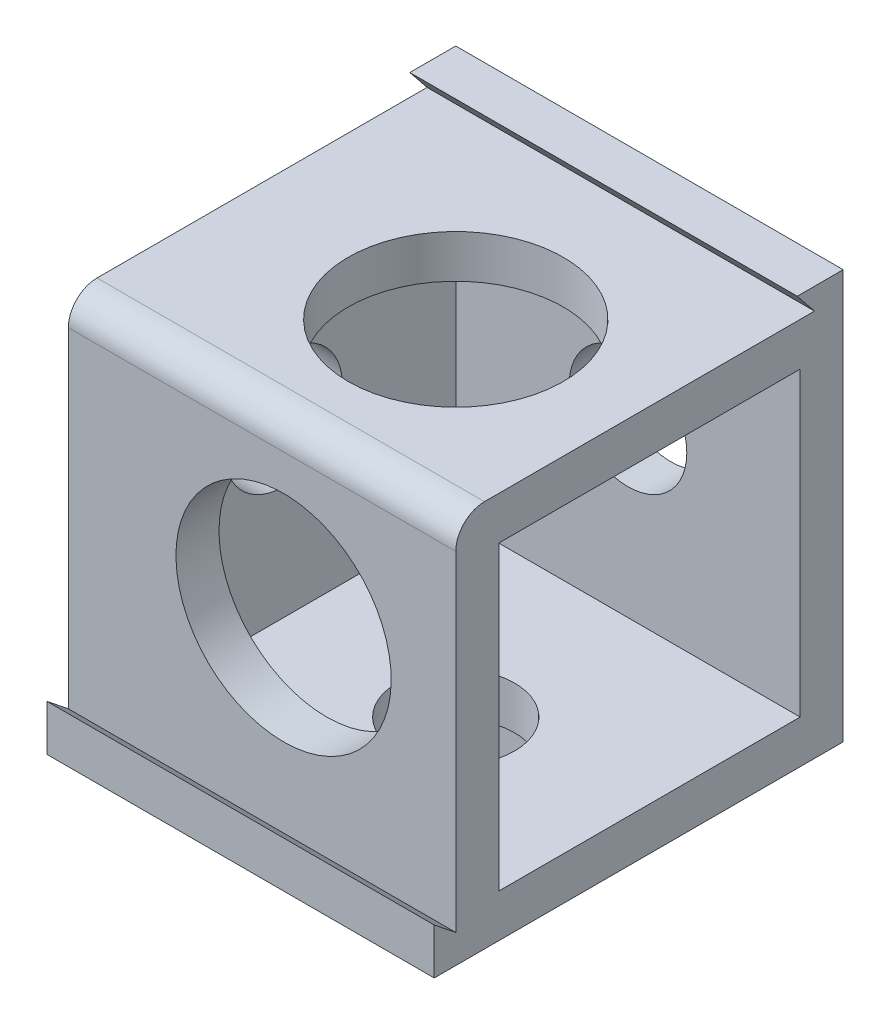
ISO-10303-21;
HEADER;
FILE_DESCRIPTION(('STEP AP214'),'2;1');
FILE_NAME('part.step','',(''),(''),'','','');
FILE_SCHEMA(('AUTOMOTIVE_DESIGN { 1 0 10303 214 1 1 1 1 }'));
ENDSEC;
DATA;
#1=APPLICATION_CONTEXT('core data for automotive mechanical design processes');
#2=APPLICATION_PROTOCOL_DEFINITION('international standard','automotive_design',2000,#1);
#3=PRODUCT_CONTEXT('',#1,'mechanical');
#4=PRODUCT('Part','Part','',(#3));
#5=PRODUCT_RELATED_PRODUCT_CATEGORY('part','',(#4));
#6=PRODUCT_DEFINITION_FORMATION('','',#4);
#7=PRODUCT_DEFINITION_CONTEXT('part definition',#1,'design');
#8=PRODUCT_DEFINITION('design','',#6,#7);
#9=PRODUCT_DEFINITION_SHAPE('','',#8);
#10=(LENGTH_UNIT() NAMED_UNIT(*) SI_UNIT(.MILLI.,.METRE.));
#11=(NAMED_UNIT(*) PLANE_ANGLE_UNIT() SI_UNIT($,.RADIAN.));
#12=(NAMED_UNIT(*) SI_UNIT($,.STERADIAN.) SOLID_ANGLE_UNIT());
#13=UNCERTAINTY_MEASURE_WITH_UNIT(LENGTH_MEASURE(1.E-05),#10,'distance_accuracy_value','');
#14=(GEOMETRIC_REPRESENTATION_CONTEXT(3) GLOBAL_UNCERTAINTY_ASSIGNED_CONTEXT((#13)) GLOBAL_UNIT_ASSIGNED_CONTEXT((#10,
#11,#12)) REPRESENTATION_CONTEXT('',''));
#15=CARTESIAN_POINT('',(0.,0.,0.));
#16=DIRECTION('',(0.,0.,1.));
#17=DIRECTION('',(1.,0.,0.));
#18=AXIS2_PLACEMENT_3D('',#15,#16,#17);
#19=CARTESIAN_POINT('',(0.,13.5,-15.));
#20=DIRECTION('',(-1.,0.,0.));
#21=DIRECTION('',(0.,-1.,0.));
#22=AXIS2_PLACEMENT_3D('',#19,#20,#21);
#23=PLANE('',#22);
#24=DIRECTION('',(0.,0.,-1.));
#25=VECTOR('',#24,1.);
#26=CARTESIAN_POINT('',(0.,-6.1,-3.85));
#27=LINE('',#26,#25);
#28=CARTESIAN_POINT('',(0.,-6.1,3.85));
#29=VERTEX_POINT('',#28);
#30=CARTESIAN_POINT('',(0.,-6.1,-3.85));
#31=VERTEX_POINT('',#30);
#32=EDGE_CURVE('E257',#29,#31,#27,.T.);
#33=ORIENTED_EDGE('',*,*,#32,.F.);
#34=DIRECTION('',(0.,1.,0.));
#35=VECTOR('',#34,1.);
#36=CARTESIAN_POINT('',(0.,-6.1,3.85));
#37=LINE('',#36,#35);
#38=CARTESIAN_POINT('',(0.,-14.5,3.85));
#39=VERTEX_POINT('',#38);
#40=EDGE_CURVE('E243',#39,#29,#37,.T.);
#41=ORIENTED_EDGE('',*,*,#40,.F.);
#42=DIRECTION('',(0.,0.,1.));
#43=VECTOR('',#42,1.);
#44=CARTESIAN_POINT('',(0.,-14.5,-3.85));
#45=LINE('',#44,#43);
#46=CARTESIAN_POINT('',(0.,-14.5,-3.85));
#47=VERTEX_POINT('',#46);
#48=EDGE_CURVE('E248',#47,#39,#45,.T.);
#49=ORIENTED_EDGE('',*,*,#48,.F.);
#50=DIRECTION('',(0.,-1.,0.));
#51=VECTOR('',#50,1.);
#52=CARTESIAN_POINT('',(0.,-6.1,-3.85));
#53=LINE('',#52,#51);
#54=EDGE_CURVE('E259',#31,#47,#53,.T.);
#55=ORIENTED_EDGE('',*,*,#54,.F.);
#56=EDGE_LOOP('',(#33,#41,#49,#55));
#57=FACE_BOUND('',#56,.T.);
#58=DIRECTION('',(0.,1.,0.));
#59=VECTOR('',#58,1.);
#60=CARTESIAN_POINT('',(0.,12.,12.));
#61=LINE('',#60,#59);
#62=CARTESIAN_POINT('',(0.,-13.,12.));
#63=VERTEX_POINT('',#62);
#64=CARTESIAN_POINT('',(0.,10.,12.));
#65=VERTEX_POINT('',#64);
#66=EDGE_CURVE('E304',#63,#65,#61,.T.);
#67=ORIENTED_EDGE('',*,*,#66,.T.);
#68=CARTESIAN_POINT('',(0.,10.,10.));
#69=DIRECTION('',(-1.,0.,0.));
#70=DIRECTION('',(0.,-1.,0.));
#71=AXIS2_PLACEMENT_3D('',#68,#69,#70);
#72=CIRCLE('',#71,2.);
#73=CARTESIAN_POINT('',(0.,12.,10.));
#74=VERTEX_POINT('',#73);
#75=EDGE_CURVE('E368',#65,#74,#72,.T.);
#76=ORIENTED_EDGE('',*,*,#75,.T.);
#77=DIRECTION('',(0.,0.,-1.));
#78=VECTOR('',#77,1.);
#79=CARTESIAN_POINT('',(0.,12.,-13.));
#80=LINE('',#79,#78);
#81=CARTESIAN_POINT('',(0.,12.,-13.));
#82=VERTEX_POINT('',#81);
#83=EDGE_CURVE('E318',#74,#82,#80,.T.);
#84=ORIENTED_EDGE('',*,*,#83,.T.);
#85=DIRECTION('',(0.,0.78086880944303,0.624695047554425));
#86=VECTOR('',#85,1.);
#87=CARTESIAN_POINT('',(0.,13.5,-11.8));
#88=LINE('',#87,#86);
#89=CARTESIAN_POINT('',(0.,13.5,-11.8));
#90=VERTEX_POINT('',#89);
#91=EDGE_CURVE('E320',#82,#90,#88,.T.);
#92=ORIENTED_EDGE('',*,*,#91,.T.);
#93=DIRECTION('',(0.,0.,1.));
#94=VECTOR('',#93,1.);
#95=CARTESIAN_POINT('',(0.,13.5,-15.));
#96=LINE('',#95,#94);
#97=CARTESIAN_POINT('',(0.,13.5,-15.));
#98=VERTEX_POINT('',#97);
#99=EDGE_CURVE('E361',#98,#90,#96,.T.);
#100=ORIENTED_EDGE('',*,*,#99,.F.);
#101=DIRECTION('',(0.,-1.,0.));
#102=VECTOR('',#101,1.);
#103=CARTESIAN_POINT('',(0.,13.5,-15.));
#104=LINE('',#103,#102);
#105=CARTESIAN_POINT('',(0.,-15.,-15.));
#106=VERTEX_POINT('',#105);
#107=EDGE_CURVE('E348',#98,#106,#104,.T.);
#108=ORIENTED_EDGE('',*,*,#107,.T.);
#109=DIRECTION('',(0.,0.,1.));
#110=VECTOR('',#109,1.);
#111=CARTESIAN_POINT('',(0.,-15.,-15.));
#112=LINE('',#111,#110);
#113=CARTESIAN_POINT('',(0.,-15.,13.5));
#114=VERTEX_POINT('',#113);
#115=EDGE_CURVE('E358',#106,#114,#112,.T.);
#116=ORIENTED_EDGE('',*,*,#115,.T.);
#117=DIRECTION('',(0.,-1.,0.));
#118=VECTOR('',#117,1.);
#119=CARTESIAN_POINT('',(0.,13.5,13.5));
#120=LINE('',#119,#118);
#121=CARTESIAN_POINT('',(0.,-11.8,13.5));
#122=VERTEX_POINT('',#121);
#123=EDGE_CURVE('E337',#122,#114,#120,.T.);
#124=ORIENTED_EDGE('',*,*,#123,.F.);
#125=DIRECTION('',(0.,-0.624695047554425,-0.78086880944303));
#126=VECTOR('',#125,1.);
#127=CARTESIAN_POINT('',(0.,-11.8,13.5));
#128=LINE('',#127,#126);
#129=EDGE_CURVE('E309',#122,#63,#128,.T.);
#130=ORIENTED_EDGE('',*,*,#129,.T.);
#131=EDGE_LOOP('',(#67,#76,#84,#92,#100,#108,#116,#124,#130));
#132=FACE_BOUND('',#131,.T.);
#133=CARTESIAN_POINT('',(0.,0.,0.));
#134=DIRECTION('',(1.,0.,0.));
#135=DIRECTION('',(0.,0.,-1.));
#136=AXIS2_PLACEMENT_3D('',#133,#134,#135);
#137=CIRCLE('',#136,4.1);
#138=CARTESIAN_POINT('',(0.,0.,-4.1));
#139=VERTEX_POINT('',#138);
#140=EDGE_CURVE('E381',#139,#139,#137,.T.);
#141=ORIENTED_EDGE('',*,*,#140,.T.);
#142=EDGE_LOOP('',(#141));
#143=FACE_BOUND('',#142,.T.);
#144=ADVANCED_FACE('F16',(#57,#132,#143),#23,.T.);
#145=CARTESIAN_POINT('',(3.,13.5,-15.));
#146=DIRECTION('',(-1.,0.,0.));
#147=DIRECTION('',(0.,-1.,0.));
#148=AXIS2_PLACEMENT_3D('',#145,#146,#147);
#149=PLANE('',#148);
#150=DIRECTION('',(0.,0.,1.));
#151=VECTOR('',#150,1.);
#152=CARTESIAN_POINT('',(3.,-12.,-15.));
#153=LINE('',#152,#151);
#154=CARTESIAN_POINT('',(3.,-12.,-12.));
#155=VERTEX_POINT('',#154);
#156=CARTESIAN_POINT('',(3.,-12.,9.));
#157=VERTEX_POINT('',#156);
#158=EDGE_CURVE('E282',#155,#157,#153,.T.);
#159=ORIENTED_EDGE('',*,*,#158,.F.);
#160=DIRECTION('',(0.,-1.,0.));
#161=VECTOR('',#160,1.);
#162=CARTESIAN_POINT('',(3.,0.,-12.));
#163=LINE('',#162,#161);
#164=CARTESIAN_POINT('',(3.,9.,-12.));
#165=VERTEX_POINT('',#164);
#166=EDGE_CURVE('E278',#165,#155,#163,.T.);
#167=ORIENTED_EDGE('',*,*,#166,.F.);
#168=DIRECTION('',(0.,0.,-1.));
#169=VECTOR('',#168,1.);
#170=CARTESIAN_POINT('',(3.,9.,-15.));
#171=LINE('',#170,#169);
#172=CARTESIAN_POINT('',(3.,9.,9.));
#173=VERTEX_POINT('',#172);
#174=EDGE_CURVE('E274',#173,#165,#171,.T.);
#175=ORIENTED_EDGE('',*,*,#174,.F.);
#176=DIRECTION('',(0.,1.,0.));
#177=VECTOR('',#176,1.);
#178=CARTESIAN_POINT('',(3.,13.5,9.));
#179=LINE('',#178,#177);
#180=EDGE_CURVE('E272',#157,#173,#179,.T.);
#181=ORIENTED_EDGE('',*,*,#180,.F.);
#182=EDGE_LOOP('',(#159,#167,#175,#181));
#183=FACE_BOUND('',#182,.T.);
#184=CARTESIAN_POINT('',(3.,0.,0.));
#185=DIRECTION('',(-1.,0.,0.));
#186=DIRECTION('',(0.,-1.,0.));
#187=AXIS2_PLACEMENT_3D('',#184,#185,#186);
#188=CIRCLE('',#187,4.1);
#189=CARTESIAN_POINT('',(3.,-4.1,0.));
#190=VERTEX_POINT('',#189);
#191=EDGE_CURVE('E379',#190,#190,#188,.F.);
#192=ORIENTED_EDGE('',*,*,#191,.F.);
#193=EDGE_LOOP('',(#192));
#194=FACE_BOUND('',#193,.T.);
#195=ADVANCED_FACE('F430',(#183,#194),#149,.F.);
#196=CARTESIAN_POINT('',(27.,12.,12.));
#197=DIRECTION('',(0.,0.,1.));
#198=DIRECTION('',(0.,-1.,0.));
#199=AXIS2_PLACEMENT_3D('',#196,#197,#198);
#200=PLANE('',#199);
#201=DIRECTION('',(0.,1.,0.));
#202=VECTOR('',#201,1.);
#203=CARTESIAN_POINT('',(27.,12.,12.));
#204=LINE('',#203,#202);
#205=CARTESIAN_POINT('',(27.,-13.,12.));
#206=VERTEX_POINT('',#205);
#207=CARTESIAN_POINT('',(27.,10.,12.));
#208=VERTEX_POINT('',#207);
#209=EDGE_CURVE('E305',#206,#208,#204,.T.);
#210=ORIENTED_EDGE('',*,*,#209,.T.);
#211=DIRECTION('',(-1.,0.,0.));
#212=VECTOR('',#211,1.);
#213=CARTESIAN_POINT('',(27.,10.,12.));
#214=LINE('',#213,#212);
#215=EDGE_CURVE('E357',#208,#65,#214,.T.);
#216=ORIENTED_EDGE('',*,*,#215,.T.);
#217=ORIENTED_EDGE('',*,*,#66,.F.);
#218=DIRECTION('',(-1.,0.,0.));
#219=VECTOR('',#218,1.);
#220=CARTESIAN_POINT('',(27.,-13.,12.));
#221=LINE('',#220,#219);
#222=EDGE_CURVE('E315',#206,#63,#221,.T.);
#223=ORIENTED_EDGE('',*,*,#222,.F.);
#224=EDGE_LOOP('',(#210,#216,#217,#223));
#225=FACE_BOUND('',#224,.T.);
#226=CARTESIAN_POINT('',(15.,0.,12.));
#227=DIRECTION('',(0.,0.,1.));
#228=DIRECTION('',(0.,-1.,0.));
#229=AXIS2_PLACEMENT_3D('',#226,#227,#228);
#230=CIRCLE('',#229,7.5);
#231=CARTESIAN_POINT('',(15.,-7.5,12.));
#232=VERTEX_POINT('',#231);
#233=EDGE_CURVE('E375',#232,#232,#230,.F.);
#234=ORIENTED_EDGE('',*,*,#233,.T.);
#235=EDGE_LOOP('',(#234));
#236=FACE_BOUND('',#235,.T.);
#237=ADVANCED_FACE('F437',(#225,#236),#200,.T.);
#238=CARTESIAN_POINT('',(27.,12.,9.));
#239=DIRECTION('',(0.,0.,1.));
#240=DIRECTION('',(0.,-1.,0.));
#241=AXIS2_PLACEMENT_3D('',#238,#239,#240);
#242=PLANE('',#241);
#243=DIRECTION('',(-1.,0.,0.));
#244=VECTOR('',#243,1.);
#245=CARTESIAN_POINT('',(0.,-12.,9.));
#246=LINE('',#245,#244);
#247=CARTESIAN_POINT('',(27.,-12.,9.));
#248=VERTEX_POINT('',#247);
#249=EDGE_CURVE('E302',#248,#157,#246,.T.);
#250=ORIENTED_EDGE('',*,*,#249,.T.);
#251=ORIENTED_EDGE('',*,*,#180,.T.);
#252=DIRECTION('',(1.,0.,0.));
#253=VECTOR('',#252,1.);
#254=CARTESIAN_POINT('',(27.,9.,9.));
#255=LINE('',#254,#253);
#256=CARTESIAN_POINT('',(27.,9.,9.));
#257=VERTEX_POINT('',#256);
#258=EDGE_CURVE('E288',#173,#257,#255,.T.);
#259=ORIENTED_EDGE('',*,*,#258,.T.);
#260=DIRECTION('',(0.,1.,0.));
#261=VECTOR('',#260,1.);
#262=CARTESIAN_POINT('',(27.,12.,9.));
#263=LINE('',#262,#261);
#264=EDGE_CURVE('E277',#248,#257,#263,.T.);
#265=ORIENTED_EDGE('',*,*,#264,.F.);
#266=EDGE_LOOP('',(#250,#251,#259,#265));
#267=FACE_BOUND('',#266,.T.);
#268=CARTESIAN_POINT('',(15.,0.,9.));
#269=DIRECTION('',(0.,0.,1.));
#270=DIRECTION('',(0.,-1.,0.));
#271=AXIS2_PLACEMENT_3D('',#268,#269,#270);
#272=CIRCLE('',#271,7.5);
#273=CARTESIAN_POINT('',(15.,-7.5,9.));
#274=VERTEX_POINT('',#273);
#275=EDGE_CURVE('E376',#274,#274,#272,.F.);
#276=ORIENTED_EDGE('',*,*,#275,.F.);
#277=EDGE_LOOP('',(#276));
#278=FACE_BOUND('',#277,.T.);
#279=ADVANCED_FACE('F496',(#267,#278),#242,.F.);
#280=CARTESIAN_POINT('',(27.,12.,-13.));
#281=DIRECTION('',(0.,1.,0.));
#282=DIRECTION('',(0.,0.,1.));
#283=AXIS2_PLACEMENT_3D('',#280,#281,#282);
#284=PLANE('',#283);
#285=ORIENTED_EDGE('',*,*,#83,.F.);
#286=DIRECTION('',(-1.,0.,0.));
#287=VECTOR('',#286,1.);
#288=CARTESIAN_POINT('',(27.,12.,10.));
#289=LINE('',#288,#287);
#290=CARTESIAN_POINT('',(27.,12.,10.));
#291=VERTEX_POINT('',#290);
#292=EDGE_CURVE('E25',#74,#291,#289,.F.);
#293=ORIENTED_EDGE('',*,*,#292,.T.);
#294=DIRECTION('',(0.,0.,-1.));
#295=VECTOR('',#294,1.);
#296=CARTESIAN_POINT('',(27.,12.,-13.));
#297=LINE('',#296,#295);
#298=CARTESIAN_POINT('',(27.,12.,-13.));
#299=VERTEX_POINT('',#298);
#300=EDGE_CURVE('E308',#291,#299,#297,.T.);
#301=ORIENTED_EDGE('',*,*,#300,.T.);
#302=DIRECTION('',(-1.,0.,0.));
#303=VECTOR('',#302,1.);
#304=CARTESIAN_POINT('',(27.,12.,-13.));
#305=LINE('',#304,#303);
#306=EDGE_CURVE('E331',#299,#82,#305,.T.);
#307=ORIENTED_EDGE('',*,*,#306,.T.);
#308=EDGE_LOOP('',(#285,#293,#301,#307));
#309=FACE_BOUND('',#308,.T.);
#310=CARTESIAN_POINT('',(15.,12.,0.));
#311=DIRECTION('',(0.,1.,0.));
#312=DIRECTION('',(0.,0.,1.));
#313=AXIS2_PLACEMENT_3D('',#310,#311,#312);
#314=CIRCLE('',#313,7.5);
#315=CARTESIAN_POINT('',(15.,12.,7.5));
#316=VERTEX_POINT('',#315);
#317=EDGE_CURVE('E374',#316,#316,#314,.F.);
#318=ORIENTED_EDGE('',*,*,#317,.T.);
#319=EDGE_LOOP('',(#318));
#320=FACE_BOUND('',#319,.T.);
#321=ADVANCED_FACE('F492',(#309,#320),#284,.T.);
#322=CARTESIAN_POINT('',(27.,9.,-13.));
#323=DIRECTION('',(0.,1.,0.));
#324=DIRECTION('',(0.,0.,1.));
#325=AXIS2_PLACEMENT_3D('',#322,#323,#324);
#326=PLANE('',#325);
#327=DIRECTION('',(1.,0.,0.));
#328=VECTOR('',#327,1.);
#329=CARTESIAN_POINT('',(27.,9.,-12.));
#330=LINE('',#329,#328);
#331=CARTESIAN_POINT('',(27.,9.,-12.));
#332=VERTEX_POINT('',#331);
#333=EDGE_CURVE('E291',#165,#332,#330,.T.);
#334=ORIENTED_EDGE('',*,*,#333,.T.);
#335=DIRECTION('',(0.,0.,-1.));
#336=VECTOR('',#335,1.);
#337=CARTESIAN_POINT('',(27.,9.,-13.));
#338=LINE('',#337,#336);
#339=EDGE_CURVE('E292',#257,#332,#338,.T.);
#340=ORIENTED_EDGE('',*,*,#339,.F.);
#341=ORIENTED_EDGE('',*,*,#258,.F.);
#342=ORIENTED_EDGE('',*,*,#174,.T.);
#343=EDGE_LOOP('',(#334,#340,#341,#342));
#344=FACE_BOUND('',#343,.T.);
#345=CARTESIAN_POINT('',(15.,9.,0.));
#346=DIRECTION('',(0.,1.,0.));
#347=DIRECTION('',(0.,0.,1.));
#348=AXIS2_PLACEMENT_3D('',#345,#346,#347);
#349=CIRCLE('',#348,7.5);
#350=CARTESIAN_POINT('',(15.,9.,7.5));
#351=VERTEX_POINT('',#350);
#352=EDGE_CURVE('E371',#351,#351,#349,.F.);
#353=ORIENTED_EDGE('',*,*,#352,.F.);
#354=EDGE_LOOP('',(#353));
#355=FACE_BOUND('',#354,.T.);
#356=ADVANCED_FACE('F495',(#344,#355),#326,.F.);
#357=CARTESIAN_POINT('',(0.,-15.,-15.));
#358=DIRECTION('',(0.,-1.,0.));
#359=DIRECTION('',(1.,0.,0.));
#360=AXIS2_PLACEMENT_3D('',#357,#358,#359);
#361=PLANE('',#360);
#362=CARTESIAN_POINT('',(15.,-15.,0.));
#363=DIRECTION('',(0.,-1.,0.));
#364=DIRECTION('',(1.,0.,0.));
#365=AXIS2_PLACEMENT_3D('',#362,#363,#364);
#366=CIRCLE('',#365,4.1);
#367=CARTESIAN_POINT('',(19.1,-15.,0.));
#368=VERTEX_POINT('',#367);
#369=EDGE_CURVE('E385',#368,#368,#366,.T.);
#370=ORIENTED_EDGE('',*,*,#369,.F.);
#371=EDGE_LOOP('',(#370));
#372=FACE_BOUND('',#371,.T.);
#373=DIRECTION('',(0.,0.,1.));
#374=VECTOR('',#373,1.);
#375=CARTESIAN_POINT('',(27.,-15.,-15.));
#376=LINE('',#375,#374);
#377=CARTESIAN_POINT('',(27.,-15.,-15.));
#378=VERTEX_POINT('',#377);
#379=CARTESIAN_POINT('',(27.,-15.,13.5));
#380=VERTEX_POINT('',#379);
#381=EDGE_CURVE('E355',#378,#380,#376,.T.);
#382=ORIENTED_EDGE('',*,*,#381,.T.);
#383=DIRECTION('',(1.,0.,0.));
#384=VECTOR('',#383,1.);
#385=CARTESIAN_POINT('',(0.,-15.,13.5));
#386=LINE('',#385,#384);
#387=EDGE_CURVE('E339',#114,#380,#386,.T.);
#388=ORIENTED_EDGE('',*,*,#387,.F.);
#389=ORIENTED_EDGE('',*,*,#115,.F.);
#390=DIRECTION('',(1.,0.,0.));
#391=VECTOR('',#390,1.);
#392=CARTESIAN_POINT('',(0.,-15.,-15.));
#393=LINE('',#392,#391);
#394=EDGE_CURVE('E351',#106,#378,#393,.T.);
#395=ORIENTED_EDGE('',*,*,#394,.T.);
#396=EDGE_LOOP('',(#382,#388,#389,#395));
#397=FACE_BOUND('',#396,.T.);
#398=DIRECTION('',(-1.,0.,0.));
#399=VECTOR('',#398,1.);
#400=CARTESIAN_POINT('',(11.2,-15.,-6.1));
#401=LINE('',#400,#399);
#402=CARTESIAN_POINT('',(18.9,-15.,-6.1));
#403=VERTEX_POINT('',#402);
#404=CARTESIAN_POINT('',(11.2,-15.,-6.1));
#405=VERTEX_POINT('',#404);
#406=EDGE_CURVE('E406',#403,#405,#401,.T.);
#407=ORIENTED_EDGE('',*,*,#406,.F.);
#408=DIRECTION('',(0.,0.,1.));
#409=VECTOR('',#408,1.);
#410=CARTESIAN_POINT('',(18.9,-15.,-6.1));
#411=LINE('',#410,#409);
#412=CARTESIAN_POINT('',(18.9,-15.,-14.5));
#413=VERTEX_POINT('',#412);
#414=EDGE_CURVE('E207',#413,#403,#411,.T.);
#415=ORIENTED_EDGE('',*,*,#414,.F.);
#416=DIRECTION('',(1.,0.,0.));
#417=VECTOR('',#416,1.);
#418=CARTESIAN_POINT('',(11.2,-15.,-14.5));
#419=LINE('',#418,#417);
#420=CARTESIAN_POINT('',(11.2,-15.,-14.5));
#421=VERTEX_POINT('',#420);
#422=EDGE_CURVE('E203',#421,#413,#419,.T.);
#423=ORIENTED_EDGE('',*,*,#422,.F.);
#424=DIRECTION('',(0.,0.,-1.));
#425=VECTOR('',#424,1.);
#426=CARTESIAN_POINT('',(11.2,-15.,-6.1));
#427=LINE('',#426,#425);
#428=EDGE_CURVE('E408',#405,#421,#427,.T.);
#429=ORIENTED_EDGE('',*,*,#428,.F.);
#430=EDGE_LOOP('',(#407,#415,#423,#429));
#431=FACE_BOUND('',#430,.T.);
#432=ADVANCED_FACE('F413',(#372,#397,#431),#361,.T.);
#433=CARTESIAN_POINT('',(0.,0.,-15.));
#434=DIRECTION('',(0.,0.,1.));
#435=DIRECTION('',(1.,0.,0.));
#436=AXIS2_PLACEMENT_3D('',#433,#434,#435);
#437=PLANE('',#436);
#438=CARTESIAN_POINT('',(15.,0.,-15.));
#439=DIRECTION('',(0.,0.,1.));
#440=DIRECTION('',(1.,0.,0.));
#441=AXIS2_PLACEMENT_3D('',#438,#439,#440);
#442=CIRCLE('',#441,4.1);
#443=CARTESIAN_POINT('',(19.1,0.,-15.));
#444=VERTEX_POINT('',#443);
#445=EDGE_CURVE('E384',#444,#444,#442,.T.);
#446=ORIENTED_EDGE('',*,*,#445,.T.);
#447=EDGE_LOOP('',(#446));
#448=FACE_BOUND('',#447,.T.);
#449=DIRECTION('',(0.,1.,0.));
#450=VECTOR('',#449,1.);
#451=CARTESIAN_POINT('',(27.,13.5,-15.));
#452=LINE('',#451,#450);
#453=CARTESIAN_POINT('',(27.,13.5,-15.));
#454=VERTEX_POINT('',#453);
#455=EDGE_CURVE('E342',#378,#454,#452,.T.);
#456=ORIENTED_EDGE('',*,*,#455,.F.);
#457=ORIENTED_EDGE('',*,*,#394,.F.);
#458=ORIENTED_EDGE('',*,*,#107,.F.);
#459=DIRECTION('',(-1.,0.,0.));
#460=VECTOR('',#459,1.);
#461=CARTESIAN_POINT('',(0.,13.5,-15.));
#462=LINE('',#461,#460);
#463=EDGE_CURVE('E345',#454,#98,#462,.T.);
#464=ORIENTED_EDGE('',*,*,#463,.F.);
#465=EDGE_LOOP('',(#456,#457,#458,#464));
#466=FACE_BOUND('',#465,.T.);
#467=DIRECTION('',(0.,1.,0.));
#468=VECTOR('',#467,1.);
#469=CARTESIAN_POINT('',(0.5,3.85,-15.));
#470=LINE('',#469,#468);
#471=CARTESIAN_POINT('',(0.5,-3.85,-15.));
#472=VERTEX_POINT('',#471);
#473=CARTESIAN_POINT('',(0.5,3.85,-15.));
#474=VERTEX_POINT('',#473);
#475=EDGE_CURVE('E209',#472,#474,#470,.T.);
#476=ORIENTED_EDGE('',*,*,#475,.F.);
#477=DIRECTION('',(-1.,0.,0.));
#478=VECTOR('',#477,1.);
#479=CARTESIAN_POINT('',(8.9,-3.85,-15.));
#480=LINE('',#479,#478);
#481=CARTESIAN_POINT('',(8.9,-3.85,-15.));
#482=VERTEX_POINT('',#481);
#483=EDGE_CURVE('E220',#482,#472,#480,.T.);
#484=ORIENTED_EDGE('',*,*,#483,.F.);
#485=DIRECTION('',(0.,-1.,0.));
#486=VECTOR('',#485,1.);
#487=CARTESIAN_POINT('',(8.9,3.85,-15.));
#488=LINE('',#487,#486);
#489=CARTESIAN_POINT('',(8.9,3.85,-15.));
#490=VERTEX_POINT('',#489);
#491=EDGE_CURVE('E228',#490,#482,#488,.T.);
#492=ORIENTED_EDGE('',*,*,#491,.F.);
#493=DIRECTION('',(1.,0.,0.));
#494=VECTOR('',#493,1.);
#495=CARTESIAN_POINT('',(8.9,3.85,-15.));
#496=LINE('',#495,#494);
#497=EDGE_CURVE('E41',#474,#490,#496,.T.);
#498=ORIENTED_EDGE('',*,*,#497,.F.);
#499=EDGE_LOOP('',(#476,#484,#492,#498));
#500=FACE_BOUND('',#499,.T.);
#501=ADVANCED_FACE('F451',(#448,#466,#500),#437,.F.);
#502=CARTESIAN_POINT('',(27.,13.5,-15.));
#503=DIRECTION('',(1.,0.,0.));
#504=DIRECTION('',(0.,1.,0.));
#505=AXIS2_PLACEMENT_3D('',#502,#503,#504);
#506=PLANE('',#505);
#507=DIRECTION('',(0.,1.,0.));
#508=VECTOR('',#507,1.);
#509=CARTESIAN_POINT('',(27.,0.,-12.));
#510=LINE('',#509,#508);
#511=CARTESIAN_POINT('',(27.,-12.,-12.));
#512=VERTEX_POINT('',#511);
#513=EDGE_CURVE('E281',#512,#332,#510,.T.);
#514=ORIENTED_EDGE('',*,*,#513,.F.);
#515=DIRECTION('',(0.,0.,1.));
#516=VECTOR('',#515,1.);
#517=CARTESIAN_POINT('',(27.,-12.,-15.));
#518=LINE('',#517,#516);
#519=EDGE_CURVE('E285',#512,#248,#518,.T.);
#520=ORIENTED_EDGE('',*,*,#519,.T.);
#521=ORIENTED_EDGE('',*,*,#264,.T.);
#522=ORIENTED_EDGE('',*,*,#339,.T.);
#523=EDGE_LOOP('',(#514,#520,#521,#522));
#524=FACE_BOUND('',#523,.T.);
#525=ORIENTED_EDGE('',*,*,#300,.F.);
#526=CARTESIAN_POINT('',(27.,10.,10.));
#527=DIRECTION('',(1.,0.,0.));
#528=DIRECTION('',(0.,1.,0.));
#529=AXIS2_PLACEMENT_3D('',#526,#527,#528);
#530=CIRCLE('',#529,2.);
#531=EDGE_CURVE('E11',#291,#208,#530,.T.);
#532=ORIENTED_EDGE('',*,*,#531,.T.);
#533=ORIENTED_EDGE('',*,*,#209,.F.);
#534=DIRECTION('',(0.,-0.624695047554425,-0.78086880944303));
#535=VECTOR('',#534,1.);
#536=CARTESIAN_POINT('',(27.,-11.8,13.5));
#537=LINE('',#536,#535);
#538=CARTESIAN_POINT('',(27.,-11.8,13.5));
#539=VERTEX_POINT('',#538);
#540=EDGE_CURVE('E313',#539,#206,#537,.T.);
#541=ORIENTED_EDGE('',*,*,#540,.F.);
#542=DIRECTION('',(0.,1.,0.));
#543=VECTOR('',#542,1.);
#544=CARTESIAN_POINT('',(27.,13.5,13.5));
#545=LINE('',#544,#543);
#546=EDGE_CURVE('E334',#380,#539,#545,.T.);
#547=ORIENTED_EDGE('',*,*,#546,.F.);
#548=ORIENTED_EDGE('',*,*,#381,.F.);
#549=ORIENTED_EDGE('',*,*,#455,.T.);
#550=DIRECTION('',(0.,0.,1.));
#551=VECTOR('',#550,1.);
#552=CARTESIAN_POINT('',(27.,13.5,-15.));
#553=LINE('',#552,#551);
#554=CARTESIAN_POINT('',(27.,13.5,-11.8));
#555=VERTEX_POINT('',#554);
#556=EDGE_CURVE('E354',#454,#555,#553,.T.);
#557=ORIENTED_EDGE('',*,*,#556,.T.);
#558=DIRECTION('',(0.,0.78086880944303,0.624695047554425));
#559=VECTOR('',#558,1.);
#560=CARTESIAN_POINT('',(27.,13.5,-11.8));
#561=LINE('',#560,#559);
#562=EDGE_CURVE('E311',#299,#555,#561,.T.);
#563=ORIENTED_EDGE('',*,*,#562,.F.);
#564=EDGE_LOOP('',(#525,#532,#533,#541,#547,#548,#549,#557,#563));
#565=FACE_BOUND('',#564,.T.);
#566=ADVANCED_FACE('F448',(#524,#565),#506,.T.);
#567=CARTESIAN_POINT('',(0.,13.5,-15.));
#568=DIRECTION('',(0.,1.,0.));
#569=DIRECTION('',(0.,0.,1.));
#570=AXIS2_PLACEMENT_3D('',#567,#568,#569);
#571=PLANE('',#570);
#572=ORIENTED_EDGE('',*,*,#99,.T.);
#573=DIRECTION('',(-1.,0.,0.));
#574=VECTOR('',#573,1.);
#575=CARTESIAN_POINT('',(27.,13.5,-11.8));
#576=LINE('',#575,#574);
#577=EDGE_CURVE('E329',#555,#90,#576,.T.);
#578=ORIENTED_EDGE('',*,*,#577,.F.);
#579=ORIENTED_EDGE('',*,*,#556,.F.);
#580=ORIENTED_EDGE('',*,*,#463,.T.);
#581=EDGE_LOOP('',(#572,#578,#579,#580));
#582=FACE_BOUND('',#581,.T.);
#583=ADVANCED_FACE('F445',(#582),#571,.T.);
#584=CARTESIAN_POINT('',(0.,0.,13.5));
#585=DIRECTION('',(0.,0.,1.));
#586=DIRECTION('',(1.,0.,0.));
#587=AXIS2_PLACEMENT_3D('',#584,#585,#586);
#588=PLANE('',#587);
#589=ORIENTED_EDGE('',*,*,#546,.T.);
#590=DIRECTION('',(-1.,0.,0.));
#591=VECTOR('',#590,1.);
#592=CARTESIAN_POINT('',(27.,-11.8,13.5));
#593=LINE('',#592,#591);
#594=EDGE_CURVE('E326',#539,#122,#593,.T.);
#595=ORIENTED_EDGE('',*,*,#594,.T.);
#596=ORIENTED_EDGE('',*,*,#123,.T.);
#597=ORIENTED_EDGE('',*,*,#387,.T.);
#598=EDGE_LOOP('',(#589,#595,#596,#597));
#599=FACE_BOUND('',#598,.T.);
#600=ADVANCED_FACE('F447',(#599),#588,.T.);
#601=CARTESIAN_POINT('',(27.,13.5,-11.8));
#602=DIRECTION('',(0.,-0.624695047554425,0.78086880944303));
#603=DIRECTION('',(0.,-0.78086880944303,-0.624695047554425));
#604=AXIS2_PLACEMENT_3D('',#601,#602,#603);
#605=PLANE('',#604);
#606=ORIENTED_EDGE('',*,*,#91,.F.);
#607=ORIENTED_EDGE('',*,*,#306,.F.);
#608=ORIENTED_EDGE('',*,*,#562,.T.);
#609=ORIENTED_EDGE('',*,*,#577,.T.);
#610=EDGE_LOOP('',(#606,#607,#608,#609));
#611=FACE_BOUND('',#610,.T.);
#612=ADVANCED_FACE('F491',(#611),#605,.T.);
#613=CARTESIAN_POINT('',(27.,-11.8,13.5));
#614=DIRECTION('',(0.,0.78086880944303,-0.624695047554425));
#615=DIRECTION('',(0.,0.624695047554425,0.78086880944303));
#616=AXIS2_PLACEMENT_3D('',#613,#614,#615);
#617=PLANE('',#616);
#618=ORIENTED_EDGE('',*,*,#129,.F.);
#619=ORIENTED_EDGE('',*,*,#594,.F.);
#620=ORIENTED_EDGE('',*,*,#540,.T.);
#621=ORIENTED_EDGE('',*,*,#222,.T.);
#622=EDGE_LOOP('',(#618,#619,#620,#621));
#623=FACE_BOUND('',#622,.T.);
#624=ADVANCED_FACE('F477',(#623),#617,.T.);
#625=CARTESIAN_POINT('',(27.,10.,10.));
#626=DIRECTION('',(-1.,0.,0.));
#627=DIRECTION('',(0.,0.,1.));
#628=AXIS2_PLACEMENT_3D('',#625,#626,#627);
#629=CYLINDRICAL_SURFACE('',#628,2.);
#630=ORIENTED_EDGE('',*,*,#531,.F.);
#631=ORIENTED_EDGE('',*,*,#292,.F.);
#632=ORIENTED_EDGE('',*,*,#75,.F.);
#633=ORIENTED_EDGE('',*,*,#215,.F.);
#634=EDGE_LOOP('',(#630,#631,#632,#633));
#635=FACE_BOUND('',#634,.T.);
#636=ADVANCED_FACE('F18',(#635),#629,.T.);
#637=CARTESIAN_POINT('',(0.,-12.,-15.));
#638=DIRECTION('',(0.,-1.,0.));
#639=DIRECTION('',(1.,0.,0.));
#640=AXIS2_PLACEMENT_3D('',#637,#638,#639);
#641=PLANE('',#640);
#642=CARTESIAN_POINT('',(15.,-12.,0.));
#643=DIRECTION('',(0.,-1.,0.));
#644=DIRECTION('',(1.,0.,0.));
#645=AXIS2_PLACEMENT_3D('',#642,#643,#644);
#646=CIRCLE('',#645,4.1);
#647=CARTESIAN_POINT('',(19.1,-12.,0.));
#648=VERTEX_POINT('',#647);
#649=EDGE_CURVE('E20',#648,#648,#646,.T.);
#650=ORIENTED_EDGE('',*,*,#649,.T.);
#651=EDGE_LOOP('',(#650));
#652=FACE_BOUND('',#651,.T.);
#653=ORIENTED_EDGE('',*,*,#519,.F.);
#654=DIRECTION('',(1.,0.,0.));
#655=VECTOR('',#654,1.);
#656=CARTESIAN_POINT('',(0.,-12.,-12.));
#657=LINE('',#656,#655);
#658=EDGE_CURVE('E280',#155,#512,#657,.T.);
#659=ORIENTED_EDGE('',*,*,#658,.F.);
#660=ORIENTED_EDGE('',*,*,#158,.T.);
#661=ORIENTED_EDGE('',*,*,#249,.F.);
#662=EDGE_LOOP('',(#653,#659,#660,#661));
#663=FACE_BOUND('',#662,.T.);
#664=ADVANCED_FACE('F552',(#652,#663),#641,.F.);
#665=CARTESIAN_POINT('',(0.,0.,-12.));
#666=DIRECTION('',(0.,0.,1.));
#667=DIRECTION('',(1.,0.,0.));
#668=AXIS2_PLACEMENT_3D('',#665,#666,#667);
#669=PLANE('',#668);
#670=CARTESIAN_POINT('',(15.,0.,-12.));
#671=DIRECTION('',(0.,0.,1.));
#672=DIRECTION('',(1.,0.,0.));
#673=AXIS2_PLACEMENT_3D('',#670,#671,#672);
#674=CIRCLE('',#673,4.1);
#675=CARTESIAN_POINT('',(19.1,0.,-12.));
#676=VERTEX_POINT('',#675);
#677=EDGE_CURVE('E382',#676,#676,#674,.T.);
#678=ORIENTED_EDGE('',*,*,#677,.F.);
#679=EDGE_LOOP('',(#678));
#680=FACE_BOUND('',#679,.T.);
#681=ORIENTED_EDGE('',*,*,#166,.T.);
#682=ORIENTED_EDGE('',*,*,#658,.T.);
#683=ORIENTED_EDGE('',*,*,#513,.T.);
#684=ORIENTED_EDGE('',*,*,#333,.F.);
#685=EDGE_LOOP('',(#681,#682,#683,#684));
#686=FACE_BOUND('',#685,.T.);
#687=ADVANCED_FACE('F559',(#680,#686),#669,.T.);
#688=CARTESIAN_POINT('',(-5.,-6.1,3.85));
#689=DIRECTION('',(0.,0.,-1.));
#690=DIRECTION('',(0.,1.,0.));
#691=AXIS2_PLACEMENT_3D('',#688,#689,#690);
#692=PLANE('',#691);
#693=ORIENTED_EDGE('',*,*,#40,.T.);
#694=DIRECTION('',(1.,0.,0.));
#695=VECTOR('',#694,1.);
#696=CARTESIAN_POINT('',(-5.,-6.1,3.85));
#697=LINE('',#696,#695);
#698=CARTESIAN_POINT('',(-5.,-6.1,3.85));
#699=VERTEX_POINT('',#698);
#700=EDGE_CURVE('E270',#699,#29,#697,.T.);
#701=ORIENTED_EDGE('',*,*,#700,.F.);
#702=DIRECTION('',(0.,1.,0.));
#703=VECTOR('',#702,1.);
#704=CARTESIAN_POINT('',(-5.,-6.1,3.85));
#705=LINE('',#704,#703);
#706=CARTESIAN_POINT('',(-5.,-14.5,3.85));
#707=VERTEX_POINT('',#706);
#708=EDGE_CURVE('E244',#707,#699,#705,.T.);
#709=ORIENTED_EDGE('',*,*,#708,.F.);
#710=DIRECTION('',(1.,0.,0.));
#711=VECTOR('',#710,1.);
#712=CARTESIAN_POINT('',(-5.,-14.5,3.85));
#713=LINE('',#712,#711);
#714=EDGE_CURVE('E254',#707,#39,#713,.T.);
#715=ORIENTED_EDGE('',*,*,#714,.T.);
#716=EDGE_LOOP('',(#693,#701,#709,#715));
#717=FACE_BOUND('',#716,.T.);
#718=ADVANCED_FACE('F568',(#717),#692,.F.);
#719=CARTESIAN_POINT('',(-5.,-6.1,-3.85));
#720=DIRECTION('',(0.,-1.,0.));
#721=DIRECTION('',(1.,0.,0.));
#722=AXIS2_PLACEMENT_3D('',#719,#720,#721);
#723=PLANE('',#722);
#724=ORIENTED_EDGE('',*,*,#32,.T.);
#725=DIRECTION('',(1.,0.,0.));
#726=VECTOR('',#725,1.);
#727=CARTESIAN_POINT('',(-5.,-6.1,-3.85));
#728=LINE('',#727,#726);
#729=CARTESIAN_POINT('',(-5.,-6.1,-3.85));
#730=VERTEX_POINT('',#729);
#731=EDGE_CURVE('E267',#730,#31,#728,.T.);
#732=ORIENTED_EDGE('',*,*,#731,.F.);
#733=DIRECTION('',(0.,0.,-1.));
#734=VECTOR('',#733,1.);
#735=CARTESIAN_POINT('',(-5.,-6.1,-3.85));
#736=LINE('',#735,#734);
#737=EDGE_CURVE('E247',#699,#730,#736,.T.);
#738=ORIENTED_EDGE('',*,*,#737,.F.);
#739=ORIENTED_EDGE('',*,*,#700,.T.);
#740=EDGE_LOOP('',(#724,#732,#738,#739));
#741=FACE_BOUND('',#740,.T.);
#742=ADVANCED_FACE('F576',(#741),#723,.F.);
#743=CARTESIAN_POINT('',(-5.,-6.1,-3.85));
#744=DIRECTION('',(0.,0.,1.));
#745=DIRECTION('',(0.,-1.,0.));
#746=AXIS2_PLACEMENT_3D('',#743,#744,#745);
#747=PLANE('',#746);
#748=ORIENTED_EDGE('',*,*,#54,.T.);
#749=DIRECTION('',(1.,0.,0.));
#750=VECTOR('',#749,1.);
#751=CARTESIAN_POINT('',(-5.,-14.5,-3.85));
#752=LINE('',#751,#750);
#753=CARTESIAN_POINT('',(-5.,-14.5,-3.85));
#754=VERTEX_POINT('',#753);
#755=EDGE_CURVE('E265',#754,#47,#752,.T.);
#756=ORIENTED_EDGE('',*,*,#755,.F.);
#757=DIRECTION('',(0.,-1.,0.));
#758=VECTOR('',#757,1.);
#759=CARTESIAN_POINT('',(-5.,-6.1,-3.85));
#760=LINE('',#759,#758);
#761=EDGE_CURVE('E250',#730,#754,#760,.T.);
#762=ORIENTED_EDGE('',*,*,#761,.F.);
#763=ORIENTED_EDGE('',*,*,#731,.T.);
#764=EDGE_LOOP('',(#748,#756,#762,#763));
#765=FACE_BOUND('',#764,.T.);
#766=ADVANCED_FACE('F585',(#765),#747,.F.);
#767=CARTESIAN_POINT('',(-5.,-14.5,-3.85));
#768=DIRECTION('',(0.,1.,0.));
#769=DIRECTION('',(-1.,0.,0.));
#770=AXIS2_PLACEMENT_3D('',#767,#768,#769);
#771=PLANE('',#770);
#772=ORIENTED_EDGE('',*,*,#48,.T.);
#773=ORIENTED_EDGE('',*,*,#714,.F.);
#774=DIRECTION('',(0.,0.,1.));
#775=VECTOR('',#774,1.);
#776=CARTESIAN_POINT('',(-5.,-14.5,-3.85));
#777=LINE('',#776,#775);
#778=EDGE_CURVE('E252',#754,#707,#777,.T.);
#779=ORIENTED_EDGE('',*,*,#778,.F.);
#780=ORIENTED_EDGE('',*,*,#755,.T.);
#781=EDGE_LOOP('',(#772,#773,#779,#780));
#782=FACE_BOUND('',#781,.T.);
#783=ADVANCED_FACE('F594',(#782),#771,.F.);
#784=CARTESIAN_POINT('',(-5.,0.,0.));
#785=DIRECTION('',(-1.,0.,0.));
#786=DIRECTION('',(0.,-1.,0.));
#787=AXIS2_PLACEMENT_3D('',#784,#785,#786);
#788=PLANE('',#787);
#789=ORIENTED_EDGE('',*,*,#708,.T.);
#790=ORIENTED_EDGE('',*,*,#737,.T.);
#791=ORIENTED_EDGE('',*,*,#761,.T.);
#792=ORIENTED_EDGE('',*,*,#778,.T.);
#793=EDGE_LOOP('',(#789,#790,#791,#792));
#794=FACE_BOUND('',#793,.T.);
#795=ADVANCED_FACE('F603',(#794),#788,.T.);
#796=CARTESIAN_POINT('',(0.5,3.85,-20.));
#797=DIRECTION('',(1.,0.,0.));
#798=DIRECTION('',(0.,1.,0.));
#799=AXIS2_PLACEMENT_3D('',#796,#797,#798);
#800=PLANE('',#799);
#801=ORIENTED_EDGE('',*,*,#475,.T.);
#802=DIRECTION('',(0.,0.,1.));
#803=VECTOR('',#802,1.);
#804=CARTESIAN_POINT('',(0.5,3.85,-20.));
#805=LINE('',#804,#803);
#806=CARTESIAN_POINT('',(0.5,3.85,-20.));
#807=VERTEX_POINT('',#806);
#808=EDGE_CURVE('E241',#807,#474,#805,.T.);
#809=ORIENTED_EDGE('',*,*,#808,.F.);
#810=DIRECTION('',(0.,1.,0.));
#811=VECTOR('',#810,1.);
#812=CARTESIAN_POINT('',(0.5,3.85,-20.));
#813=LINE('',#812,#811);
#814=CARTESIAN_POINT('',(0.5,-3.85,-20.));
#815=VERTEX_POINT('',#814);
#816=EDGE_CURVE('E216',#815,#807,#813,.T.);
#817=ORIENTED_EDGE('',*,*,#816,.F.);
#818=DIRECTION('',(0.,0.,1.));
#819=VECTOR('',#818,1.);
#820=CARTESIAN_POINT('',(0.5,-3.85,-20.));
#821=LINE('',#820,#819);
#822=EDGE_CURVE('E225',#815,#472,#821,.T.);
#823=ORIENTED_EDGE('',*,*,#822,.T.);
#824=EDGE_LOOP('',(#801,#809,#817,#823));
#825=FACE_BOUND('',#824,.T.);
#826=ADVANCED_FACE('F612',(#825),#800,.F.);
#827=CARTESIAN_POINT('',(8.9,3.85,-20.));
#828=DIRECTION('',(0.,-1.,0.));
#829=DIRECTION('',(0.,0.,-1.));
#830=AXIS2_PLACEMENT_3D('',#827,#828,#829);
#831=PLANE('',#830);
#832=ORIENTED_EDGE('',*,*,#497,.T.);
#833=DIRECTION('',(0.,0.,1.));
#834=VECTOR('',#833,1.);
#835=CARTESIAN_POINT('',(8.9,3.85,-20.));
#836=LINE('',#835,#834);
#837=CARTESIAN_POINT('',(8.9,3.85,-20.));
#838=VERTEX_POINT('',#837);
#839=EDGE_CURVE('E238',#838,#490,#836,.T.);
#840=ORIENTED_EDGE('',*,*,#839,.F.);
#841=DIRECTION('',(1.,0.,0.));
#842=VECTOR('',#841,1.);
#843=CARTESIAN_POINT('',(8.9,3.85,-20.));
#844=LINE('',#843,#842);
#845=EDGE_CURVE('E219',#807,#838,#844,.T.);
#846=ORIENTED_EDGE('',*,*,#845,.F.);
#847=ORIENTED_EDGE('',*,*,#808,.T.);
#848=EDGE_LOOP('',(#832,#840,#846,#847));
#849=FACE_BOUND('',#848,.T.);
#850=ADVANCED_FACE('F621',(#849),#831,.F.);
#851=CARTESIAN_POINT('',(8.9,3.85,-20.));
#852=DIRECTION('',(-1.,0.,0.));
#853=DIRECTION('',(0.,-1.,0.));
#854=AXIS2_PLACEMENT_3D('',#851,#852,#853);
#855=PLANE('',#854);
#856=ORIENTED_EDGE('',*,*,#491,.T.);
#857=DIRECTION('',(0.,0.,1.));
#858=VECTOR('',#857,1.);
#859=CARTESIAN_POINT('',(8.9,-3.85,-20.));
#860=LINE('',#859,#858);
#861=CARTESIAN_POINT('',(8.9,-3.85,-20.));
#862=VERTEX_POINT('',#861);
#863=EDGE_CURVE('E235',#862,#482,#860,.T.);
#864=ORIENTED_EDGE('',*,*,#863,.F.);
#865=DIRECTION('',(0.,-1.,0.));
#866=VECTOR('',#865,1.);
#867=CARTESIAN_POINT('',(8.9,3.85,-20.));
#868=LINE('',#867,#866);
#869=EDGE_CURVE('E222',#838,#862,#868,.T.);
#870=ORIENTED_EDGE('',*,*,#869,.F.);
#871=ORIENTED_EDGE('',*,*,#839,.T.);
#872=EDGE_LOOP('',(#856,#864,#870,#871));
#873=FACE_BOUND('',#872,.T.);
#874=ADVANCED_FACE('F630',(#873),#855,.F.);
#875=CARTESIAN_POINT('',(8.9,-3.85,-20.));
#876=DIRECTION('',(0.,1.,0.));
#877=DIRECTION('',(0.,0.,1.));
#878=AXIS2_PLACEMENT_3D('',#875,#876,#877);
#879=PLANE('',#878);
#880=ORIENTED_EDGE('',*,*,#483,.T.);
#881=ORIENTED_EDGE('',*,*,#822,.F.);
#882=DIRECTION('',(-1.,0.,0.));
#883=VECTOR('',#882,1.);
#884=CARTESIAN_POINT('',(8.9,-3.85,-20.));
#885=LINE('',#884,#883);
#886=EDGE_CURVE('E224',#862,#815,#885,.T.);
#887=ORIENTED_EDGE('',*,*,#886,.F.);
#888=ORIENTED_EDGE('',*,*,#863,.T.);
#889=EDGE_LOOP('',(#880,#881,#887,#888));
#890=FACE_BOUND('',#889,.T.);
#891=ADVANCED_FACE('F639',(#890),#879,.F.);
#892=CARTESIAN_POINT('',(0.,0.,-20.));
#893=DIRECTION('',(0.,0.,-1.));
#894=DIRECTION('',(-1.,0.,0.));
#895=AXIS2_PLACEMENT_3D('',#892,#893,#894);
#896=PLANE('',#895);
#897=ORIENTED_EDGE('',*,*,#816,.T.);
#898=ORIENTED_EDGE('',*,*,#845,.T.);
#899=ORIENTED_EDGE('',*,*,#869,.T.);
#900=ORIENTED_EDGE('',*,*,#886,.T.);
#901=EDGE_LOOP('',(#897,#898,#899,#900));
#902=FACE_BOUND('',#901,.T.);
#903=ADVANCED_FACE('F648',(#902),#896,.T.);
#904=CARTESIAN_POINT('',(18.9,-20.,-6.1));
#905=DIRECTION('',(-1.,0.,0.));
#906=DIRECTION('',(0.,-1.,0.));
#907=AXIS2_PLACEMENT_3D('',#904,#905,#906);
#908=PLANE('',#907);
#909=ORIENTED_EDGE('',*,*,#414,.T.);
#910=DIRECTION('',(0.,1.,0.));
#911=VECTOR('',#910,1.);
#912=CARTESIAN_POINT('',(18.9,-20.,-6.1));
#913=LINE('',#912,#911);
#914=CARTESIAN_POINT('',(18.9,-20.,-6.1));
#915=VERTEX_POINT('',#914);
#916=EDGE_CURVE('E188',#915,#403,#913,.T.);
#917=ORIENTED_EDGE('',*,*,#916,.F.);
#918=DIRECTION('',(0.,0.,1.));
#919=VECTOR('',#918,1.);
#920=CARTESIAN_POINT('',(18.9,-20.,-6.1));
#921=LINE('',#920,#919);
#922=CARTESIAN_POINT('',(18.9,-20.,-14.5));
#923=VERTEX_POINT('',#922);
#924=EDGE_CURVE('E195',#923,#915,#921,.T.);
#925=ORIENTED_EDGE('',*,*,#924,.F.);
#926=DIRECTION('',(0.,1.,0.));
#927=VECTOR('',#926,1.);
#928=CARTESIAN_POINT('',(18.9,-20.,-14.5));
#929=LINE('',#928,#927);
#930=EDGE_CURVE('E404',#923,#413,#929,.T.);
#931=ORIENTED_EDGE('',*,*,#930,.T.);
#932=EDGE_LOOP('',(#909,#917,#925,#931));
#933=FACE_BOUND('',#932,.T.);
#934=ADVANCED_FACE('F205',(#933),#908,.F.);
#935=CARTESIAN_POINT('',(11.2,-20.,-6.1));
#936=DIRECTION('',(0.,0.,-1.));
#937=DIRECTION('',(-1.,0.,0.));
#938=AXIS2_PLACEMENT_3D('',#935,#936,#937);
#939=PLANE('',#938);
#940=ORIENTED_EDGE('',*,*,#406,.T.);
#941=DIRECTION('',(0.,1.,0.));
#942=VECTOR('',#941,1.);
#943=CARTESIAN_POINT('',(11.2,-20.,-6.1));
#944=LINE('',#943,#942);
#945=CARTESIAN_POINT('',(11.2,-20.,-6.1));
#946=VERTEX_POINT('',#945);
#947=EDGE_CURVE('E191',#946,#405,#944,.T.);
#948=ORIENTED_EDGE('',*,*,#947,.F.);
#949=DIRECTION('',(-1.,0.,0.));
#950=VECTOR('',#949,1.);
#951=CARTESIAN_POINT('',(11.2,-20.,-6.1));
#952=LINE('',#951,#950);
#953=EDGE_CURVE('E184',#915,#946,#952,.T.);
#954=ORIENTED_EDGE('',*,*,#953,.F.);
#955=ORIENTED_EDGE('',*,*,#916,.T.);
#956=EDGE_LOOP('',(#940,#948,#954,#955));
#957=FACE_BOUND('',#956,.T.);
#958=ADVANCED_FACE('F186',(#957),#939,.F.);
#959=CARTESIAN_POINT('',(11.2,-20.,-6.1));
#960=DIRECTION('',(1.,0.,0.));
#961=DIRECTION('',(0.,1.,0.));
#962=AXIS2_PLACEMENT_3D('',#959,#960,#961);
#963=PLANE('',#962);
#964=ORIENTED_EDGE('',*,*,#428,.T.);
#965=DIRECTION('',(0.,1.,0.));
#966=VECTOR('',#965,1.);
#967=CARTESIAN_POINT('',(11.2,-20.,-14.5));
#968=LINE('',#967,#966);
#969=CARTESIAN_POINT('',(11.2,-20.,-14.5));
#970=VERTEX_POINT('',#969);
#971=EDGE_CURVE('E33',#970,#421,#968,.T.);
#972=ORIENTED_EDGE('',*,*,#971,.F.);
#973=DIRECTION('',(0.,0.,-1.));
#974=VECTOR('',#973,1.);
#975=CARTESIAN_POINT('',(11.2,-20.,-6.1));
#976=LINE('',#975,#974);
#977=EDGE_CURVE('E194',#946,#970,#976,.T.);
#978=ORIENTED_EDGE('',*,*,#977,.F.);
#979=ORIENTED_EDGE('',*,*,#947,.T.);
#980=EDGE_LOOP('',(#964,#972,#978,#979));
#981=FACE_BOUND('',#980,.T.);
#982=ADVANCED_FACE('F416',(#981),#963,.F.);
#983=CARTESIAN_POINT('',(11.2,-20.,-14.5));
#984=DIRECTION('',(0.,0.,1.));
#985=DIRECTION('',(1.,0.,0.));
#986=AXIS2_PLACEMENT_3D('',#983,#984,#985);
#987=PLANE('',#986);
#988=ORIENTED_EDGE('',*,*,#422,.T.);
#989=ORIENTED_EDGE('',*,*,#930,.F.);
#990=DIRECTION('',(1.,0.,0.));
#991=VECTOR('',#990,1.);
#992=CARTESIAN_POINT('',(11.2,-20.,-14.5));
#993=LINE('',#992,#991);
#994=EDGE_CURVE('E199',#970,#923,#993,.T.);
#995=ORIENTED_EDGE('',*,*,#994,.F.);
#996=ORIENTED_EDGE('',*,*,#971,.T.);
#997=EDGE_LOOP('',(#988,#989,#995,#996));
#998=FACE_BOUND('',#997,.T.);
#999=ADVANCED_FACE('F417',(#998),#987,.F.);
#1000=CARTESIAN_POINT('',(0.,-20.,0.));
#1001=DIRECTION('',(0.,-1.,0.));
#1002=DIRECTION('',(0.,0.,-1.));
#1003=AXIS2_PLACEMENT_3D('',#1000,#1001,#1002);
#1004=PLANE('',#1003);
#1005=ORIENTED_EDGE('',*,*,#924,.T.);
#1006=ORIENTED_EDGE('',*,*,#953,.T.);
#1007=ORIENTED_EDGE('',*,*,#977,.T.);
#1008=ORIENTED_EDGE('',*,*,#994,.T.);
#1009=EDGE_LOOP('',(#1005,#1006,#1007,#1008));
#1010=FACE_BOUND('',#1009,.T.);
#1011=ADVANCED_FACE('F198',(#1010),#1004,.T.);
#1012=CARTESIAN_POINT('',(15.,13.5,0.));
#1013=DIRECTION('',(0.,-1.,0.));
#1014=DIRECTION('',(0.,0.,-1.));
#1015=AXIS2_PLACEMENT_3D('',#1012,#1013,#1014);
#1016=CYLINDRICAL_SURFACE('',#1015,7.5);
#1017=ORIENTED_EDGE('',*,*,#317,.F.);
#1018=EDGE_LOOP('',(#1017));
#1019=FACE_BOUND('',#1018,.T.);
#1020=ORIENTED_EDGE('',*,*,#352,.T.);
#1021=EDGE_LOOP('',(#1020));
#1022=FACE_BOUND('',#1021,.T.);
#1023=ADVANCED_FACE('F426',(#1019,#1022),#1016,.F.);
#1024=CARTESIAN_POINT('',(15.,0.,13.5));
#1025=DIRECTION('',(0.,0.,-1.));
#1026=DIRECTION('',(-1.,0.,0.));
#1027=AXIS2_PLACEMENT_3D('',#1024,#1025,#1026);
#1028=CYLINDRICAL_SURFACE('',#1027,7.5);
#1029=ORIENTED_EDGE('',*,*,#233,.F.);
#1030=EDGE_LOOP('',(#1029));
#1031=FACE_BOUND('',#1030,.T.);
#1032=ORIENTED_EDGE('',*,*,#275,.T.);
#1033=EDGE_LOOP('',(#1032));
#1034=FACE_BOUND('',#1033,.T.);
#1035=ADVANCED_FACE('F502',(#1031,#1034),#1028,.F.);
#1036=CARTESIAN_POINT('',(27.,0.,0.));
#1037=DIRECTION('',(-1.,0.,0.));
#1038=DIRECTION('',(0.,0.,1.));
#1039=AXIS2_PLACEMENT_3D('',#1036,#1037,#1038);
#1040=CYLINDRICAL_SURFACE('',#1039,4.1);
#1041=ORIENTED_EDGE('',*,*,#140,.F.);
#1042=EDGE_LOOP('',(#1041));
#1043=FACE_BOUND('',#1042,.T.);
#1044=ORIENTED_EDGE('',*,*,#191,.T.);
#1045=EDGE_LOOP('',(#1044));
#1046=FACE_BOUND('',#1045,.T.);
#1047=ADVANCED_FACE('F741',(#1043,#1046),#1040,.F.);
#1048=CARTESIAN_POINT('',(15.,0.,-20.));
#1049=DIRECTION('',(0.,0.,1.));
#1050=DIRECTION('',(1.,0.,0.));
#1051=AXIS2_PLACEMENT_3D('',#1048,#1049,#1050);
#1052=CYLINDRICAL_SURFACE('',#1051,4.1);
#1053=ORIENTED_EDGE('',*,*,#677,.T.);
#1054=EDGE_LOOP('',(#1053));
#1055=FACE_BOUND('',#1054,.T.);
#1056=ORIENTED_EDGE('',*,*,#445,.F.);
#1057=EDGE_LOOP('',(#1056));
#1058=FACE_BOUND('',#1057,.T.);
#1059=ADVANCED_FACE('F749',(#1055,#1058),#1052,.F.);
#1060=CARTESIAN_POINT('',(15.,-20.,0.));
#1061=DIRECTION('',(0.,1.,0.));
#1062=DIRECTION('',(0.,0.,1.));
#1063=AXIS2_PLACEMENT_3D('',#1060,#1061,#1062);
#1064=CYLINDRICAL_SURFACE('',#1063,4.1);
#1065=ORIENTED_EDGE('',*,*,#369,.T.);
#1066=EDGE_LOOP('',(#1065));
#1067=FACE_BOUND('',#1066,.T.);
#1068=ORIENTED_EDGE('',*,*,#649,.F.);
#1069=EDGE_LOOP('',(#1068));
#1070=FACE_BOUND('',#1069,.T.);
#1071=ADVANCED_FACE('F758',(#1067,#1070),#1064,.F.);
#1072=CLOSED_SHELL('',(#144,#195,#237,#279,#321,#356,#432,#501,#566,#583,#600,#612,#624,#636,
#664,#687,#718,#742,#766,#783,#795,#826,#850,#874,#891,#903,#934,#958,#982,#999,#1011,#1023,
#1035,#1047,#1059,#1071));
#1073=MANIFOLD_SOLID_BREP('B1',#1072);
#1074=ADVANCED_BREP_SHAPE_REPRESENTATION('',(#18,#1073),#14);
#1075=SHAPE_DEFINITION_REPRESENTATION(#9,#1074);
ENDSEC;
END-ISO-10303-21;
